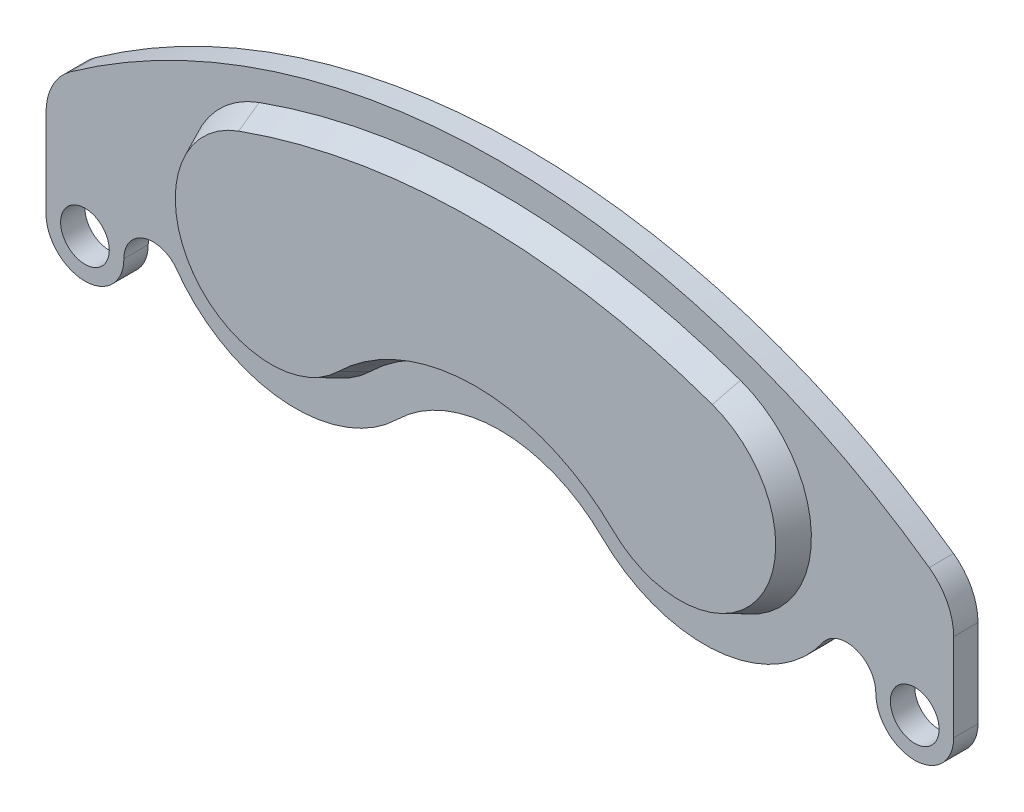
ISO-10303-21;
HEADER;
FILE_DESCRIPTION(('STEP AP214'),'2;1');
FILE_NAME('part.step','',(''),(''),'','','');
FILE_SCHEMA(('AUTOMOTIVE_DESIGN { 1 0 10303 214 1 1 1 1 }'));
ENDSEC;
DATA;
#1=APPLICATION_CONTEXT('core data for automotive mechanical design processes');
#2=APPLICATION_PROTOCOL_DEFINITION('international standard','automotive_design',2000,#1);
#3=PRODUCT_CONTEXT('',#1,'mechanical');
#4=PRODUCT('Part','Part','',(#3));
#5=PRODUCT_RELATED_PRODUCT_CATEGORY('part','',(#4));
#6=PRODUCT_DEFINITION_FORMATION('','',#4);
#7=PRODUCT_DEFINITION_CONTEXT('part definition',#1,'design');
#8=PRODUCT_DEFINITION('design','',#6,#7);
#9=PRODUCT_DEFINITION_SHAPE('','',#8);
#10=(LENGTH_UNIT() NAMED_UNIT(*) SI_UNIT(.MILLI.,.METRE.));
#11=(NAMED_UNIT(*) PLANE_ANGLE_UNIT() SI_UNIT($,.RADIAN.));
#12=(NAMED_UNIT(*) SI_UNIT($,.STERADIAN.) SOLID_ANGLE_UNIT());
#13=UNCERTAINTY_MEASURE_WITH_UNIT(LENGTH_MEASURE(1.E-05),#10,'distance_accuracy_value','');
#14=(GEOMETRIC_REPRESENTATION_CONTEXT(3) GLOBAL_UNCERTAINTY_ASSIGNED_CONTEXT((#13)) GLOBAL_UNIT_ASSIGNED_CONTEXT((#10,
#11,#12)) REPRESENTATION_CONTEXT('',''));
#15=CARTESIAN_POINT('',(0.,0.,0.));
#16=DIRECTION('',(0.,0.,1.));
#17=DIRECTION('',(1.,0.,0.));
#18=AXIS2_PLACEMENT_3D('',#15,#16,#17);
#19=CARTESIAN_POINT('',(-40.6179800402014,57.010347284101,1.25));
#20=DIRECTION('',(0.,0.,1.));
#21=DIRECTION('',(1.,0.,0.));
#22=AXIS2_PLACEMENT_3D('',#19,#20,#21);
#23=PLANE('',#22);
#24=CARTESIAN_POINT('',(-42.6179800402014,48.010347284101,1.25));
#25=DIRECTION('',(0.,0.,1.));
#26=DIRECTION('',(1.,0.,0.));
#27=AXIS2_PLACEMENT_3D('',#24,#25,#26);
#28=CIRCLE('',#27,2.5);
#29=CARTESIAN_POINT('',(-40.1179800402014,48.010347284101,1.25));
#30=VERTEX_POINT('',#29);
#31=EDGE_CURVE('E313',#30,#30,#28,.T.);
#32=ORIENTED_EDGE('',*,*,#31,.F.);
#33=EDGE_LOOP('',(#32));
#34=FACE_BOUND('',#33,.T.);
#35=CARTESIAN_POINT('',(42.6179800402014,48.010347284101,1.25));
#36=DIRECTION('',(0.,0.,1.));
#37=DIRECTION('',(1.,0.,0.));
#38=AXIS2_PLACEMENT_3D('',#35,#36,#37);
#39=CIRCLE('',#38,2.5);
#40=CARTESIAN_POINT('',(45.1179800402014,48.010347284101,1.25));
#41=VERTEX_POINT('',#40);
#42=EDGE_CURVE('E310',#41,#41,#39,.T.);
#43=ORIENTED_EDGE('',*,*,#42,.F.);
#44=EDGE_LOOP('',(#43));
#45=FACE_BOUND('',#44,.T.);
#46=CARTESIAN_POINT('',(-40.6179800402014,57.010347284101,1.25));
#47=DIRECTION('',(0.,0.,1.));
#48=DIRECTION('',(1.,0.,0.));
#49=AXIS2_PLACEMENT_3D('',#46,#47,#48);
#50=CIRCLE('',#49,6.);
#51=CARTESIAN_POINT('',(-44.0995211865043,61.8969484798811,1.25));
#52=VERTEX_POINT('',#51);
#53=CARTESIAN_POINT('',(-46.6179800402014,57.010347284101,1.25));
#54=VERTEX_POINT('',#53);
#55=EDGE_CURVE('E204',#52,#54,#50,.T.);
#56=ORIENTED_EDGE('',*,*,#55,.T.);
#57=DIRECTION('',(0.,-1.,0.));
#58=VECTOR('',#57,1.);
#59=CARTESIAN_POINT('',(-46.6179800402014,57.010347284101,1.25));
#60=LINE('',#59,#58);
#61=CARTESIAN_POINT('',(-46.6179800402014,48.010347284101,1.25));
#62=VERTEX_POINT('',#61);
#63=EDGE_CURVE('E125',#54,#62,#60,.T.);
#64=ORIENTED_EDGE('',*,*,#63,.T.);
#65=CARTESIAN_POINT('',(-42.6179800402014,48.010347284101,1.25));
#66=DIRECTION('',(0.,0.,1.));
#67=DIRECTION('',(1.,0.,0.));
#68=AXIS2_PLACEMENT_3D('',#65,#66,#67);
#69=CIRCLE('',#68,4.);
#70=CARTESIAN_POINT('',(-38.6179800402014,48.010347284101,1.25));
#71=VERTEX_POINT('',#70);
#72=EDGE_CURVE('E231',#62,#71,#69,.T.);
#73=ORIENTED_EDGE('',*,*,#72,.T.);
#74=CARTESIAN_POINT('',(-35.6179800402014,48.010347284101,1.25));
#75=DIRECTION('',(0.,0.,-1.));
#76=DIRECTION('',(-1.,0.,0.));
#77=AXIS2_PLACEMENT_3D('',#74,#75,#76);
#78=CIRCLE('',#77,3.);
#79=CARTESIAN_POINT('',(-33.3012020390615,49.9162695525669,1.25));
#80=VERTEX_POINT('',#79);
#81=EDGE_CURVE('E249',#71,#80,#78,.T.);
#82=ORIENTED_EDGE('',*,*,#81,.T.);
#83=CARTESIAN_POINT('',(-21.,58.5,1.25));
#84=DIRECTION('',(0.,0.,1.));
#85=DIRECTION('',(1.,0.,0.));
#86=AXIS2_PLACEMENT_3D('',#83,#84,#85);
#87=CIRCLE('',#86,15.);
#88=CARTESIAN_POINT('',(-10.5,47.7878573571857,1.25));
#89=VERTEX_POINT('',#88);
#90=EDGE_CURVE('E246',#80,#89,#87,.T.);
#91=ORIENTED_EDGE('',*,*,#90,.T.);
#92=CARTESIAN_POINT('',(0.,37.0757147143715,1.25));
#93=DIRECTION('',(0.,0.,-1.));
#94=DIRECTION('',(-1.,0.,0.));
#95=AXIS2_PLACEMENT_3D('',#92,#93,#94);
#96=CIRCLE('',#95,15.);
#97=CARTESIAN_POINT('',(10.5,47.7878573571857,1.25));
#98=VERTEX_POINT('',#97);
#99=EDGE_CURVE('E248',#89,#98,#96,.T.);
#100=ORIENTED_EDGE('',*,*,#99,.T.);
#101=CARTESIAN_POINT('',(21.,58.5,1.25));
#102=DIRECTION('',(0.,0.,1.));
#103=DIRECTION('',(-1.,0.,0.));
#104=AXIS2_PLACEMENT_3D('',#101,#102,#103);
#105=CIRCLE('',#104,15.);
#106=CARTESIAN_POINT('',(33.3012020390615,49.9162695525669,1.25));
#107=VERTEX_POINT('',#106);
#108=EDGE_CURVE('E251',#98,#107,#105,.T.);
#109=ORIENTED_EDGE('',*,*,#108,.T.);
#110=CARTESIAN_POINT('',(35.6179800402014,48.010347284101,1.25));
#111=DIRECTION('',(0.,0.,-1.));
#112=DIRECTION('',(1.,0.,0.));
#113=AXIS2_PLACEMENT_3D('',#110,#111,#112);
#114=CIRCLE('',#113,3.);
#115=CARTESIAN_POINT('',(38.6179800402014,48.010347284101,1.25));
#116=VERTEX_POINT('',#115);
#117=EDGE_CURVE('E257',#107,#116,#114,.T.);
#118=ORIENTED_EDGE('',*,*,#117,.T.);
#119=CARTESIAN_POINT('',(42.6179800402014,48.010347284101,1.25));
#120=DIRECTION('',(0.,0.,1.));
#121=DIRECTION('',(-1.,0.,0.));
#122=AXIS2_PLACEMENT_3D('',#119,#120,#121);
#123=CIRCLE('',#122,4.);
#124=CARTESIAN_POINT('',(46.6179800402014,48.010347284101,1.25));
#125=VERTEX_POINT('',#124);
#126=EDGE_CURVE('E159',#116,#125,#123,.T.);
#127=ORIENTED_EDGE('',*,*,#126,.T.);
#128=DIRECTION('',(0.,1.,0.));
#129=VECTOR('',#128,1.);
#130=CARTESIAN_POINT('',(46.6179800402014,57.010347284101,1.25));
#131=LINE('',#130,#129);
#132=CARTESIAN_POINT('',(46.6179800402014,57.010347284101,1.25));
#133=VERTEX_POINT('',#132);
#134=EDGE_CURVE('E152',#125,#133,#131,.T.);
#135=ORIENTED_EDGE('',*,*,#134,.T.);
#136=CARTESIAN_POINT('',(40.6179800402014,57.010347284101,1.25));
#137=DIRECTION('',(0.,0.,1.));
#138=DIRECTION('',(-1.,0.,0.));
#139=AXIS2_PLACEMENT_3D('',#136,#137,#138);
#140=CIRCLE('',#139,6.);
#141=CARTESIAN_POINT('',(44.0995211865043,61.8969484798811,1.25));
#142=VERTEX_POINT('',#141);
#143=EDGE_CURVE('E156',#133,#142,#140,.T.);
#144=ORIENTED_EDGE('',*,*,#143,.T.);
#145=CARTESIAN_POINT('',(0.,0.,1.25));
#146=DIRECTION('',(0.,0.,1.));
#147=DIRECTION('',(1.,0.,0.));
#148=AXIS2_PLACEMENT_3D('',#145,#146,#147);
#149=CIRCLE('',#148,76.);
#150=EDGE_CURVE('E72',#142,#52,#149,.T.);
#151=ORIENTED_EDGE('',*,*,#150,.T.);
#152=EDGE_LOOP('',(#56,#64,#73,#82,#91,#100,#109,#118,#127,#135,#144,#151));
#153=FACE_BOUND('',#152,.T.);
#154=CARTESIAN_POINT('',(0.,0.,1.25));
#155=DIRECTION('',(0.,0.,1.));
#156=DIRECTION('',(1.,0.,0.));
#157=AXIS2_PLACEMENT_3D('',#154,#155,#156);
#158=CIRCLE('',#157,73.16);
#159=CARTESIAN_POINT('',(24.7181853738711,68.8578021129265,1.25));
#160=VERTEX_POINT('',#159);
#161=CARTESIAN_POINT('',(-24.7181853738711,68.8578021129265,1.25));
#162=VERTEX_POINT('',#161);
#163=EDGE_CURVE('E300',#160,#162,#158,.T.);
#164=ORIENTED_EDGE('',*,*,#163,.F.);
#165=CARTESIAN_POINT('',(21.,58.5,1.25));
#166=DIRECTION('',(0.,0.,1.));
#167=DIRECTION('',(1.,0.,0.));
#168=AXIS2_PLACEMENT_3D('',#165,#166,#167);
#169=CIRCLE('',#168,11.004951934698);
#170=CARTESIAN_POINT('',(13.2965336457114,50.64089233988,1.25));
#171=VERTEX_POINT('',#170);
#172=EDGE_CURVE('E303',#171,#160,#169,.T.);
#173=ORIENTED_EDGE('',*,*,#172,.F.);
#174=CARTESIAN_POINT('',(0.,37.0757147143715,1.25));
#175=DIRECTION('',(0.,0.,-1.));
#176=DIRECTION('',(-1.,0.,0.));
#177=AXIS2_PLACEMENT_3D('',#174,#175,#176);
#178=CIRCLE('',#177,18.995048065302);
#179=CARTESIAN_POINT('',(-13.2965336457114,50.64089233988,1.25));
#180=VERTEX_POINT('',#179);
#181=EDGE_CURVE('E288',#180,#171,#178,.T.);
#182=ORIENTED_EDGE('',*,*,#181,.F.);
#183=CARTESIAN_POINT('',(-21.,58.5,1.25));
#184=DIRECTION('',(0.,0.,1.));
#185=DIRECTION('',(1.,0.,0.));
#186=AXIS2_PLACEMENT_3D('',#183,#184,#185);
#187=CIRCLE('',#186,11.004951934698);
#188=EDGE_CURVE('E298',#162,#180,#187,.T.);
#189=ORIENTED_EDGE('',*,*,#188,.F.);
#190=EDGE_LOOP('',(#164,#173,#182,#189));
#191=FACE_BOUND('',#190,.T.);
#192=ADVANCED_FACE('F48',(#34,#45,#153,#191),#23,.T.);
#193=CARTESIAN_POINT('',(-40.6179800402014,57.010347284101,1.25));
#194=DIRECTION('',(0.,0.,-1.));
#195=DIRECTION('',(-1.,0.,0.));
#196=AXIS2_PLACEMENT_3D('',#193,#194,#195);
#197=CYLINDRICAL_SURFACE('',#196,6.);
#198=CARTESIAN_POINT('',(-40.6179800402014,57.010347284101,-1.25));
#199=DIRECTION('',(0.,0.,1.));
#200=DIRECTION('',(1.,0.,0.));
#201=AXIS2_PLACEMENT_3D('',#198,#199,#200);
#202=CIRCLE('',#201,6.);
#203=CARTESIAN_POINT('',(-44.0995211865043,61.8969484798811,-1.25));
#204=VERTEX_POINT('',#203);
#205=CARTESIAN_POINT('',(-46.6179800402014,57.010347284101,-1.25));
#206=VERTEX_POINT('',#205);
#207=EDGE_CURVE('E180',#204,#206,#202,.T.);
#208=ORIENTED_EDGE('',*,*,#207,.T.);
#209=DIRECTION('',(0.,0.,-1.));
#210=VECTOR('',#209,1.);
#211=CARTESIAN_POINT('',(-46.6179800402014,57.010347284101,1.25));
#212=LINE('',#211,#210);
#213=EDGE_CURVE('E11',#54,#206,#212,.T.);
#214=ORIENTED_EDGE('',*,*,#213,.F.);
#215=ORIENTED_EDGE('',*,*,#55,.F.);
#216=DIRECTION('',(0.,0.,-1.));
#217=VECTOR('',#216,1.);
#218=CARTESIAN_POINT('',(-44.0995211865043,61.8969484798811,1.25));
#219=LINE('',#218,#217);
#220=EDGE_CURVE('E176',#52,#204,#219,.T.);
#221=ORIENTED_EDGE('',*,*,#220,.T.);
#222=EDGE_LOOP('',(#208,#214,#215,#221));
#223=FACE_BOUND('',#222,.T.);
#224=ADVANCED_FACE('F50',(#223),#197,.T.);
#225=CARTESIAN_POINT('',(-46.6179800402014,57.010347284101,1.25));
#226=DIRECTION('',(1.,0.,0.));
#227=DIRECTION('',(0.,1.,0.));
#228=AXIS2_PLACEMENT_3D('',#225,#226,#227);
#229=PLANE('',#228);
#230=DIRECTION('',(0.,-1.,0.));
#231=VECTOR('',#230,1.);
#232=CARTESIAN_POINT('',(-46.6179800402014,57.010347284101,-1.25));
#233=LINE('',#232,#231);
#234=CARTESIAN_POINT('',(-46.6179800402014,48.010347284101,-1.25));
#235=VERTEX_POINT('',#234);
#236=EDGE_CURVE('E183',#206,#235,#233,.T.);
#237=ORIENTED_EDGE('',*,*,#236,.T.);
#238=DIRECTION('',(0.,0.,-1.));
#239=VECTOR('',#238,1.);
#240=CARTESIAN_POINT('',(-46.6179800402014,48.010347284101,1.25));
#241=LINE('',#240,#239);
#242=EDGE_CURVE('E56',#62,#235,#241,.T.);
#243=ORIENTED_EDGE('',*,*,#242,.F.);
#244=ORIENTED_EDGE('',*,*,#63,.F.);
#245=ORIENTED_EDGE('',*,*,#213,.T.);
#246=EDGE_LOOP('',(#237,#243,#244,#245));
#247=FACE_BOUND('',#246,.T.);
#248=ADVANCED_FACE('F384',(#247),#229,.F.);
#249=CARTESIAN_POINT('',(-42.6179800402014,48.010347284101,1.25));
#250=DIRECTION('',(0.,0.,-1.));
#251=DIRECTION('',(-1.,0.,0.));
#252=AXIS2_PLACEMENT_3D('',#249,#250,#251);
#253=CYLINDRICAL_SURFACE('',#252,4.);
#254=CARTESIAN_POINT('',(-42.6179800402014,48.010347284101,-1.25));
#255=DIRECTION('',(0.,0.,1.));
#256=DIRECTION('',(1.,0.,0.));
#257=AXIS2_PLACEMENT_3D('',#254,#255,#256);
#258=CIRCLE('',#257,4.);
#259=CARTESIAN_POINT('',(-38.6179800402014,48.010347284101,-1.25));
#260=VERTEX_POINT('',#259);
#261=EDGE_CURVE('E186',#235,#260,#258,.T.);
#262=ORIENTED_EDGE('',*,*,#261,.T.);
#263=DIRECTION('',(0.,0.,-1.));
#264=VECTOR('',#263,1.);
#265=CARTESIAN_POINT('',(-38.6179800402014,48.010347284101,1.25));
#266=LINE('',#265,#264);
#267=EDGE_CURVE('E223',#71,#260,#266,.T.);
#268=ORIENTED_EDGE('',*,*,#267,.F.);
#269=ORIENTED_EDGE('',*,*,#72,.F.);
#270=ORIENTED_EDGE('',*,*,#242,.T.);
#271=EDGE_LOOP('',(#262,#268,#269,#270));
#272=FACE_BOUND('',#271,.T.);
#273=ADVANCED_FACE('F229',(#272),#253,.T.);
#274=CARTESIAN_POINT('',(-35.6179800402014,48.010347284101,1.25));
#275=DIRECTION('',(0.,0.,-1.));
#276=DIRECTION('',(-1.,0.,0.));
#277=AXIS2_PLACEMENT_3D('',#274,#275,#276);
#278=CYLINDRICAL_SURFACE('',#277,3.);
#279=CARTESIAN_POINT('',(-35.6179800402014,48.010347284101,-1.25));
#280=DIRECTION('',(0.,0.,-1.));
#281=DIRECTION('',(-1.,0.,0.));
#282=AXIS2_PLACEMENT_3D('',#279,#280,#281);
#283=CIRCLE('',#282,3.);
#284=CARTESIAN_POINT('',(-33.3012020390615,49.9162695525669,-1.25));
#285=VERTEX_POINT('',#284);
#286=EDGE_CURVE('E188',#260,#285,#283,.T.);
#287=ORIENTED_EDGE('',*,*,#286,.T.);
#288=DIRECTION('',(0.,0.,-1.));
#289=VECTOR('',#288,1.);
#290=CARTESIAN_POINT('',(-33.3012020390615,49.9162695525669,1.25));
#291=LINE('',#290,#289);
#292=EDGE_CURVE('E220',#80,#285,#291,.T.);
#293=ORIENTED_EDGE('',*,*,#292,.F.);
#294=ORIENTED_EDGE('',*,*,#81,.F.);
#295=ORIENTED_EDGE('',*,*,#267,.T.);
#296=EDGE_LOOP('',(#287,#293,#294,#295));
#297=FACE_BOUND('',#296,.T.);
#298=ADVANCED_FACE('F240',(#297),#278,.F.);
#299=CARTESIAN_POINT('',(-21.,58.5,1.25));
#300=DIRECTION('',(0.,0.,-1.));
#301=DIRECTION('',(-1.,0.,0.));
#302=AXIS2_PLACEMENT_3D('',#299,#300,#301);
#303=CYLINDRICAL_SURFACE('',#302,15.);
#304=CARTESIAN_POINT('',(-21.,58.5,-1.25));
#305=DIRECTION('',(0.,0.,1.));
#306=DIRECTION('',(1.,0.,0.));
#307=AXIS2_PLACEMENT_3D('',#304,#305,#306);
#308=CIRCLE('',#307,15.);
#309=CARTESIAN_POINT('',(-10.5,47.7878573571857,-1.25));
#310=VERTEX_POINT('',#309);
#311=EDGE_CURVE('E190',#285,#310,#308,.T.);
#312=ORIENTED_EDGE('',*,*,#311,.T.);
#313=DIRECTION('',(0.,0.,-1.));
#314=VECTOR('',#313,1.);
#315=CARTESIAN_POINT('',(-10.5,47.7878573571857,1.25));
#316=LINE('',#315,#314);
#317=EDGE_CURVE('E217',#89,#310,#316,.T.);
#318=ORIENTED_EDGE('',*,*,#317,.F.);
#319=ORIENTED_EDGE('',*,*,#90,.F.);
#320=ORIENTED_EDGE('',*,*,#292,.T.);
#321=EDGE_LOOP('',(#312,#318,#319,#320));
#322=FACE_BOUND('',#321,.T.);
#323=ADVANCED_FACE('F244',(#322),#303,.T.);
#324=CARTESIAN_POINT('',(0.,37.0757147143715,1.25));
#325=DIRECTION('',(0.,0.,-1.));
#326=DIRECTION('',(-1.,0.,0.));
#327=AXIS2_PLACEMENT_3D('',#324,#325,#326);
#328=CYLINDRICAL_SURFACE('',#327,15.);
#329=CARTESIAN_POINT('',(0.,37.0757147143715,-1.25));
#330=DIRECTION('',(0.,0.,-1.));
#331=DIRECTION('',(-1.,0.,0.));
#332=AXIS2_PLACEMENT_3D('',#329,#330,#331);
#333=CIRCLE('',#332,15.);
#334=CARTESIAN_POINT('',(10.5,47.7878573571857,-1.25));
#335=VERTEX_POINT('',#334);
#336=EDGE_CURVE('E192',#310,#335,#333,.T.);
#337=ORIENTED_EDGE('',*,*,#336,.T.);
#338=DIRECTION('',(0.,0.,-1.));
#339=VECTOR('',#338,1.);
#340=CARTESIAN_POINT('',(10.5,47.7878573571857,1.25));
#341=LINE('',#340,#339);
#342=EDGE_CURVE('E214',#98,#335,#341,.T.);
#343=ORIENTED_EDGE('',*,*,#342,.F.);
#344=ORIENTED_EDGE('',*,*,#99,.F.);
#345=ORIENTED_EDGE('',*,*,#317,.T.);
#346=EDGE_LOOP('',(#337,#343,#344,#345));
#347=FACE_BOUND('',#346,.T.);
#348=ADVANCED_FACE('F374',(#347),#328,.F.);
#349=CARTESIAN_POINT('',(21.,58.5,1.25));
#350=DIRECTION('',(0.,0.,-1.));
#351=DIRECTION('',(-1.,0.,0.));
#352=AXIS2_PLACEMENT_3D('',#349,#350,#351);
#353=CYLINDRICAL_SURFACE('',#352,15.);
#354=CARTESIAN_POINT('',(21.,58.5,-1.25));
#355=DIRECTION('',(0.,0.,1.));
#356=DIRECTION('',(-1.,0.,0.));
#357=AXIS2_PLACEMENT_3D('',#354,#355,#356);
#358=CIRCLE('',#357,15.);
#359=CARTESIAN_POINT('',(33.3012020390615,49.9162695525669,-1.25));
#360=VERTEX_POINT('',#359);
#361=EDGE_CURVE('E194',#335,#360,#358,.T.);
#362=ORIENTED_EDGE('',*,*,#361,.T.);
#363=DIRECTION('',(0.,0.,-1.));
#364=VECTOR('',#363,1.);
#365=CARTESIAN_POINT('',(33.3012020390615,49.9162695525669,1.25));
#366=LINE('',#365,#364);
#367=EDGE_CURVE('E211',#107,#360,#366,.T.);
#368=ORIENTED_EDGE('',*,*,#367,.F.);
#369=ORIENTED_EDGE('',*,*,#108,.F.);
#370=ORIENTED_EDGE('',*,*,#342,.T.);
#371=EDGE_LOOP('',(#362,#368,#369,#370));
#372=FACE_BOUND('',#371,.T.);
#373=ADVANCED_FACE('F371',(#372),#353,.T.);
#374=CARTESIAN_POINT('',(35.6179800402014,48.010347284101,1.25));
#375=DIRECTION('',(0.,0.,-1.));
#376=DIRECTION('',(-1.,0.,0.));
#377=AXIS2_PLACEMENT_3D('',#374,#375,#376);
#378=CYLINDRICAL_SURFACE('',#377,3.);
#379=CARTESIAN_POINT('',(35.6179800402014,48.010347284101,-1.25));
#380=DIRECTION('',(0.,0.,-1.));
#381=DIRECTION('',(1.,0.,0.));
#382=AXIS2_PLACEMENT_3D('',#379,#380,#381);
#383=CIRCLE('',#382,3.);
#384=CARTESIAN_POINT('',(38.6179800402014,48.010347284101,-1.25));
#385=VERTEX_POINT('',#384);
#386=EDGE_CURVE('E196',#360,#385,#383,.T.);
#387=ORIENTED_EDGE('',*,*,#386,.T.);
#388=DIRECTION('',(0.,0.,-1.));
#389=VECTOR('',#388,1.);
#390=CARTESIAN_POINT('',(38.6179800402014,48.010347284101,1.25));
#391=LINE('',#390,#389);
#392=EDGE_CURVE('E208',#116,#385,#391,.T.);
#393=ORIENTED_EDGE('',*,*,#392,.F.);
#394=ORIENTED_EDGE('',*,*,#117,.F.);
#395=ORIENTED_EDGE('',*,*,#367,.T.);
#396=EDGE_LOOP('',(#387,#393,#394,#395));
#397=FACE_BOUND('',#396,.T.);
#398=ADVANCED_FACE('F263',(#397),#378,.F.);
#399=CARTESIAN_POINT('',(42.6179800402014,48.010347284101,1.25));
#400=DIRECTION('',(0.,0.,-1.));
#401=DIRECTION('',(-1.,0.,0.));
#402=AXIS2_PLACEMENT_3D('',#399,#400,#401);
#403=CYLINDRICAL_SURFACE('',#402,4.);
#404=CARTESIAN_POINT('',(42.6179800402014,48.010347284101,-1.25));
#405=DIRECTION('',(0.,0.,1.));
#406=DIRECTION('',(-1.,0.,0.));
#407=AXIS2_PLACEMENT_3D('',#404,#405,#406);
#408=CIRCLE('',#407,4.);
#409=CARTESIAN_POINT('',(46.6179800402014,48.010347284101,-1.25));
#410=VERTEX_POINT('',#409);
#411=EDGE_CURVE('E198',#385,#410,#408,.T.);
#412=ORIENTED_EDGE('',*,*,#411,.T.);
#413=DIRECTION('',(0.,0.,-1.));
#414=VECTOR('',#413,1.);
#415=CARTESIAN_POINT('',(46.6179800402014,48.010347284101,1.25));
#416=LINE('',#415,#414);
#417=EDGE_CURVE('E171',#125,#410,#416,.T.);
#418=ORIENTED_EDGE('',*,*,#417,.F.);
#419=ORIENTED_EDGE('',*,*,#126,.F.);
#420=ORIENTED_EDGE('',*,*,#392,.T.);
#421=EDGE_LOOP('',(#412,#418,#419,#420));
#422=FACE_BOUND('',#421,.T.);
#423=ADVANCED_FACE('F267',(#422),#403,.T.);
#424=CARTESIAN_POINT('',(46.6179800402014,57.010347284101,1.25));
#425=DIRECTION('',(-1.,0.,0.));
#426=DIRECTION('',(0.,-1.,0.));
#427=AXIS2_PLACEMENT_3D('',#424,#425,#426);
#428=PLANE('',#427);
#429=DIRECTION('',(0.,1.,0.));
#430=VECTOR('',#429,1.);
#431=CARTESIAN_POINT('',(46.6179800402014,57.010347284101,-1.25));
#432=LINE('',#431,#430);
#433=CARTESIAN_POINT('',(46.6179800402014,57.010347284101,-1.25));
#434=VERTEX_POINT('',#433);
#435=EDGE_CURVE('E168',#410,#434,#432,.T.);
#436=ORIENTED_EDGE('',*,*,#435,.T.);
#437=DIRECTION('',(0.,0.,-1.));
#438=VECTOR('',#437,1.);
#439=CARTESIAN_POINT('',(46.6179800402014,57.010347284101,1.25));
#440=LINE('',#439,#438);
#441=EDGE_CURVE('E165',#133,#434,#440,.T.);
#442=ORIENTED_EDGE('',*,*,#441,.F.);
#443=ORIENTED_EDGE('',*,*,#134,.F.);
#444=ORIENTED_EDGE('',*,*,#417,.T.);
#445=EDGE_LOOP('',(#436,#442,#443,#444));
#446=FACE_BOUND('',#445,.T.);
#447=ADVANCED_FACE('F166',(#446),#428,.F.);
#448=CARTESIAN_POINT('',(40.6179800402014,57.010347284101,1.25));
#449=DIRECTION('',(0.,0.,-1.));
#450=DIRECTION('',(-1.,0.,0.));
#451=AXIS2_PLACEMENT_3D('',#448,#449,#450);
#452=CYLINDRICAL_SURFACE('',#451,6.);
#453=CARTESIAN_POINT('',(40.6179800402014,57.010347284101,-1.25));
#454=DIRECTION('',(0.,0.,1.));
#455=DIRECTION('',(-1.,0.,0.));
#456=AXIS2_PLACEMENT_3D('',#453,#454,#455);
#457=CIRCLE('',#456,6.);
#458=CARTESIAN_POINT('',(44.0995211865043,61.8969484798811,-1.25));
#459=VERTEX_POINT('',#458);
#460=EDGE_CURVE('E201',#434,#459,#457,.T.);
#461=ORIENTED_EDGE('',*,*,#460,.T.);
#462=DIRECTION('',(0.,0.,-1.));
#463=VECTOR('',#462,1.);
#464=CARTESIAN_POINT('',(44.0995211865043,61.8969484798811,1.25));
#465=LINE('',#464,#463);
#466=EDGE_CURVE('E172',#142,#459,#465,.T.);
#467=ORIENTED_EDGE('',*,*,#466,.F.);
#468=ORIENTED_EDGE('',*,*,#143,.F.);
#469=ORIENTED_EDGE('',*,*,#441,.T.);
#470=EDGE_LOOP('',(#461,#467,#468,#469));
#471=FACE_BOUND('',#470,.T.);
#472=ADVANCED_FACE('F174',(#471),#452,.T.);
#473=CARTESIAN_POINT('',(0.,0.,1.25));
#474=DIRECTION('',(0.,0.,-1.));
#475=DIRECTION('',(-1.,0.,0.));
#476=AXIS2_PLACEMENT_3D('',#473,#474,#475);
#477=CYLINDRICAL_SURFACE('',#476,76.);
#478=CARTESIAN_POINT('',(0.,0.,-1.25));
#479=DIRECTION('',(0.,0.,1.));
#480=DIRECTION('',(1.,0.,0.));
#481=AXIS2_PLACEMENT_3D('',#478,#479,#480);
#482=CIRCLE('',#481,76.);
#483=EDGE_CURVE('E117',#459,#204,#482,.T.);
#484=ORIENTED_EDGE('',*,*,#483,.T.);
#485=ORIENTED_EDGE('',*,*,#220,.F.);
#486=ORIENTED_EDGE('',*,*,#150,.F.);
#487=ORIENTED_EDGE('',*,*,#466,.T.);
#488=EDGE_LOOP('',(#484,#485,#486,#487));
#489=FACE_BOUND('',#488,.T.);
#490=ADVANCED_FACE('F268',(#489),#477,.T.);
#491=CARTESIAN_POINT('',(-40.6179800402014,57.010347284101,-1.25));
#492=DIRECTION('',(0.,0.,1.));
#493=DIRECTION('',(1.,0.,0.));
#494=AXIS2_PLACEMENT_3D('',#491,#492,#493);
#495=PLANE('',#494);
#496=CARTESIAN_POINT('',(-42.6179800402014,48.010347284101,-1.25));
#497=DIRECTION('',(0.,0.,1.));
#498=DIRECTION('',(1.,0.,0.));
#499=AXIS2_PLACEMENT_3D('',#496,#497,#498);
#500=CIRCLE('',#499,2.5);
#501=CARTESIAN_POINT('',(-40.1179800402014,48.010347284101,-1.25));
#502=VERTEX_POINT('',#501);
#503=EDGE_CURVE('E306',#502,#502,#500,.T.);
#504=ORIENTED_EDGE('',*,*,#503,.T.);
#505=EDGE_LOOP('',(#504));
#506=FACE_BOUND('',#505,.T.);
#507=CARTESIAN_POINT('',(42.6179800402014,48.010347284101,-1.25));
#508=DIRECTION('',(0.,0.,1.));
#509=DIRECTION('',(1.,0.,0.));
#510=AXIS2_PLACEMENT_3D('',#507,#508,#509);
#511=CIRCLE('',#510,2.5);
#512=CARTESIAN_POINT('',(45.1179800402014,48.010347284101,-1.25));
#513=VERTEX_POINT('',#512);
#514=EDGE_CURVE('E307',#513,#513,#511,.T.);
#515=ORIENTED_EDGE('',*,*,#514,.T.);
#516=EDGE_LOOP('',(#515));
#517=FACE_BOUND('',#516,.T.);
#518=ORIENTED_EDGE('',*,*,#207,.F.);
#519=ORIENTED_EDGE('',*,*,#483,.F.);
#520=ORIENTED_EDGE('',*,*,#460,.F.);
#521=ORIENTED_EDGE('',*,*,#435,.F.);
#522=ORIENTED_EDGE('',*,*,#411,.F.);
#523=ORIENTED_EDGE('',*,*,#386,.F.);
#524=ORIENTED_EDGE('',*,*,#361,.F.);
#525=ORIENTED_EDGE('',*,*,#336,.F.);
#526=ORIENTED_EDGE('',*,*,#311,.F.);
#527=ORIENTED_EDGE('',*,*,#286,.F.);
#528=ORIENTED_EDGE('',*,*,#261,.F.);
#529=ORIENTED_EDGE('',*,*,#236,.F.);
#530=EDGE_LOOP('',(#518,#519,#520,#521,#522,#523,#524,#525,#526,#527,#528,#529));
#531=FACE_BOUND('',#530,.T.);
#532=ADVANCED_FACE('F235',(#506,#517,#531),#495,.F.);
#533=CARTESIAN_POINT('',(21.,58.5,1.25));
#534=DIRECTION('',(0.,0.,-1.));
#535=DIRECTION('',(1.,0.,0.));
#536=AXIS2_PLACEMENT_3D('',#533,#534,#535);
#537=CONICAL_SURFACE('',#536,11.004951934698,0.436332312998583);
#538=ORIENTED_EDGE('',*,*,#172,.T.);
#539=DIRECTION('',(0.142787814872742,0.397766055716924,-0.90630778703665));
#540=VECTOR('',#539,1.);
#541=CARTESIAN_POINT('',(24.718185373871,68.8578021129265,1.25000000000001));
#542=LINE('',#541,#540);
#543=CARTESIAN_POINT('',(24.3243130688023,67.7605864059494,3.75));
#544=VERTEX_POINT('',#543);
#545=EDGE_CURVE('E184',#544,#160,#542,.T.);
#546=ORIENTED_EDGE('',*,*,#545,.F.);
#547=CARTESIAN_POINT('',(21.,58.5,3.75));
#548=DIRECTION('',(0.,0.,1.));
#549=DIRECTION('',(1.,0.,0.));
#550=AXIS2_PLACEMENT_3D('',#547,#548,#549);
#551=CIRCLE('',#550,9.83918278931051);
#552=CARTESIAN_POINT('',(14.1125720474826,51.4734180314789,3.75));
#553=VERTEX_POINT('',#552);
#554=EDGE_CURVE('E285',#553,#544,#551,.T.);
#555=ORIENTED_EDGE('',*,*,#554,.F.);
#556=DIRECTION('',(-0.29583278321849,-0.30180980688164,-0.90630778703665));
#557=VECTOR('',#556,1.);
#558=CARTESIAN_POINT('',(13.2965336457114,50.64089233988,1.25));
#559=LINE('',#558,#557);
#560=EDGE_CURVE('E278',#553,#171,#559,.T.);
#561=ORIENTED_EDGE('',*,*,#560,.T.);
#562=EDGE_LOOP('',(#538,#546,#555,#561));
#563=FACE_BOUND('',#562,.T.);
#564=ADVANCED_FACE('F346',(#563),#537,.T.);
#565=CARTESIAN_POINT('',(0.,0.,1.25));
#566=DIRECTION('',(0.,0.,-1.));
#567=DIRECTION('',(1.,0.,0.));
#568=AXIS2_PLACEMENT_3D('',#565,#566,#567);
#569=CONICAL_SURFACE('',#568,73.16,0.436332312998583);
#570=ORIENTED_EDGE('',*,*,#163,.T.);
#571=DIRECTION('',(-0.142787814872742,0.397766055716923,-0.90630778703665));
#572=VECTOR('',#571,1.);
#573=CARTESIAN_POINT('',(-24.7181853738711,68.8578021129265,1.25));
#574=LINE('',#573,#572);
#575=CARTESIAN_POINT('',(-24.3243130688023,67.7605864059494,3.75));
#576=VERTEX_POINT('',#575);
#577=EDGE_CURVE('E289',#576,#162,#574,.T.);
#578=ORIENTED_EDGE('',*,*,#577,.F.);
#579=CARTESIAN_POINT('',(0.,0.,3.75));
#580=DIRECTION('',(0.,0.,1.));
#581=DIRECTION('',(1.,0.,0.));
#582=AXIS2_PLACEMENT_3D('',#579,#580,#581);
#583=CIRCLE('',#582,71.9942308546125);
#584=EDGE_CURVE('E282',#544,#576,#583,.T.);
#585=ORIENTED_EDGE('',*,*,#584,.F.);
#586=ORIENTED_EDGE('',*,*,#545,.T.);
#587=EDGE_LOOP('',(#570,#578,#585,#586));
#588=FACE_BOUND('',#587,.T.);
#589=ADVANCED_FACE('F349',(#588),#569,.T.);
#590=CARTESIAN_POINT('',(-21.,58.5,1.25));
#591=DIRECTION('',(0.,0.,-1.));
#592=DIRECTION('',(1.,0.,0.));
#593=AXIS2_PLACEMENT_3D('',#590,#591,#592);
#594=CONICAL_SURFACE('',#593,11.004951934698,0.436332312998583);
#595=ORIENTED_EDGE('',*,*,#188,.T.);
#596=DIRECTION('',(0.29583278321849,-0.30180980688164,-0.90630778703665));
#597=VECTOR('',#596,1.);
#598=CARTESIAN_POINT('',(-13.2965336457114,50.64089233988,1.25));
#599=LINE('',#598,#597);
#600=CARTESIAN_POINT('',(-14.1125720474826,51.4734180314789,3.75));
#601=VERTEX_POINT('',#600);
#602=EDGE_CURVE('E63',#601,#180,#599,.T.);
#603=ORIENTED_EDGE('',*,*,#602,.F.);
#604=CARTESIAN_POINT('',(-21.,58.5,3.75));
#605=DIRECTION('',(0.,0.,1.));
#606=DIRECTION('',(1.,0.,0.));
#607=AXIS2_PLACEMENT_3D('',#604,#605,#606);
#608=CIRCLE('',#607,9.83918278931051);
#609=EDGE_CURVE('E279',#576,#601,#608,.T.);
#610=ORIENTED_EDGE('',*,*,#609,.F.);
#611=ORIENTED_EDGE('',*,*,#577,.T.);
#612=EDGE_LOOP('',(#595,#603,#610,#611));
#613=FACE_BOUND('',#612,.T.);
#614=ADVANCED_FACE('F353',(#613),#594,.T.);
#615=CARTESIAN_POINT('',(0.,37.0757147143715,1.25));
#616=DIRECTION('',(0.,0.,1.));
#617=DIRECTION('',(-1.,0.,0.));
#618=AXIS2_PLACEMENT_3D('',#615,#616,#617);
#619=CONICAL_SURFACE('',#618,18.995048065302,0.436332312998583);
#620=ORIENTED_EDGE('',*,*,#181,.T.);
#621=ORIENTED_EDGE('',*,*,#560,.F.);
#622=CARTESIAN_POINT('',(0.,37.0757147143715,3.75));
#623=DIRECTION('',(0.,0.,1.));
#624=DIRECTION('',(1.,0.,0.));
#625=AXIS2_PLACEMENT_3D('',#622,#623,#624);
#626=CIRCLE('',#625,20.1608172106895);
#627=EDGE_CURVE('E275',#601,#553,#626,.F.);
#628=ORIENTED_EDGE('',*,*,#627,.F.);
#629=ORIENTED_EDGE('',*,*,#602,.T.);
#630=EDGE_LOOP('',(#620,#621,#628,#629));
#631=FACE_BOUND('',#630,.T.);
#632=ADVANCED_FACE('F341',(#631),#619,.F.);
#633=CARTESIAN_POINT('',(10.5,29.25,3.75));
#634=DIRECTION('',(0.,0.,1.));
#635=DIRECTION('',(1.,0.,0.));
#636=AXIS2_PLACEMENT_3D('',#633,#634,#635);
#637=PLANE('',#636);
#638=ORIENTED_EDGE('',*,*,#554,.T.);
#639=ORIENTED_EDGE('',*,*,#584,.T.);
#640=ORIENTED_EDGE('',*,*,#609,.T.);
#641=ORIENTED_EDGE('',*,*,#627,.T.);
#642=EDGE_LOOP('',(#638,#639,#640,#641));
#643=FACE_BOUND('',#642,.T.);
#644=ADVANCED_FACE('F334',(#643),#637,.T.);
#645=CARTESIAN_POINT('',(42.6179800402014,48.010347284101,-1.25));
#646=DIRECTION('',(0.,0.,1.));
#647=DIRECTION('',(1.,0.,0.));
#648=AXIS2_PLACEMENT_3D('',#645,#646,#647);
#649=CYLINDRICAL_SURFACE('',#648,2.5);
#650=ORIENTED_EDGE('',*,*,#514,.F.);
#651=EDGE_LOOP('',(#650));
#652=FACE_BOUND('',#651,.T.);
#653=ORIENTED_EDGE('',*,*,#42,.T.);
#654=EDGE_LOOP('',(#653));
#655=FACE_BOUND('',#654,.T.);
#656=ADVANCED_FACE('F324',(#652,#655),#649,.F.);
#657=CARTESIAN_POINT('',(-42.6179800402014,48.010347284101,-1.25));
#658=DIRECTION('',(0.,0.,1.));
#659=DIRECTION('',(1.,0.,0.));
#660=AXIS2_PLACEMENT_3D('',#657,#658,#659);
#661=CYLINDRICAL_SURFACE('',#660,2.5);
#662=ORIENTED_EDGE('',*,*,#503,.F.);
#663=EDGE_LOOP('',(#662));
#664=FACE_BOUND('',#663,.T.);
#665=ORIENTED_EDGE('',*,*,#31,.T.);
#666=EDGE_LOOP('',(#665));
#667=FACE_BOUND('',#666,.T.);
#668=ADVANCED_FACE('F321',(#664,#667),#661,.F.);
#669=CLOSED_SHELL('',(#192,#224,#248,#273,#298,#323,#348,#373,#398,#423,#447,#472,#490,#532,
#564,#589,#614,#632,#644,#656,#668));
#670=MANIFOLD_SOLID_BREP('B2',#669);
#671=ADVANCED_BREP_SHAPE_REPRESENTATION('',(#18,#670),#14);
#672=SHAPE_DEFINITION_REPRESENTATION(#9,#671);
ENDSEC;
END-ISO-10303-21;
